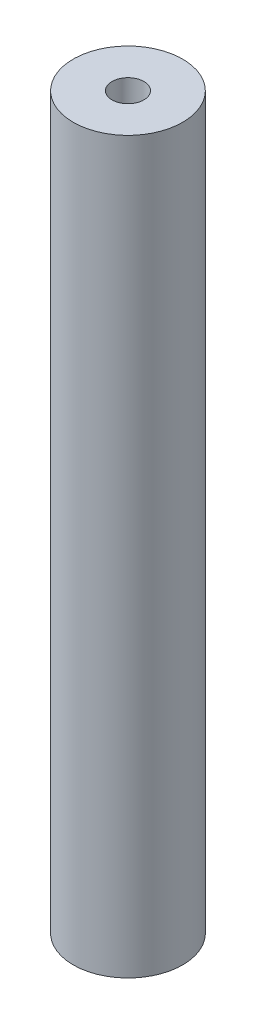
ISO-10303-21;
HEADER;
FILE_DESCRIPTION(('STEP AP214'),'2;1');
FILE_NAME('part.step','',(''),(''),'','','');
FILE_SCHEMA(('AUTOMOTIVE_DESIGN { 1 0 10303 214 1 1 1 1 }'));
ENDSEC;
DATA;
#1=APPLICATION_CONTEXT('core data for automotive mechanical design processes');
#2=APPLICATION_PROTOCOL_DEFINITION('international standard','automotive_design',2000,#1);
#3=PRODUCT_CONTEXT('',#1,'mechanical');
#4=PRODUCT('Part','Part','',(#3));
#5=PRODUCT_RELATED_PRODUCT_CATEGORY('part','',(#4));
#6=PRODUCT_DEFINITION_FORMATION('','',#4);
#7=PRODUCT_DEFINITION_CONTEXT('part definition',#1,'design');
#8=PRODUCT_DEFINITION('design','',#6,#7);
#9=PRODUCT_DEFINITION_SHAPE('','',#8);
#10=(LENGTH_UNIT() NAMED_UNIT(*) SI_UNIT(.MILLI.,.METRE.));
#11=(NAMED_UNIT(*) PLANE_ANGLE_UNIT() SI_UNIT($,.RADIAN.));
#12=(NAMED_UNIT(*) SI_UNIT($,.STERADIAN.) SOLID_ANGLE_UNIT());
#13=UNCERTAINTY_MEASURE_WITH_UNIT(LENGTH_MEASURE(1.E-05),#10,'distance_accuracy_value','');
#14=(GEOMETRIC_REPRESENTATION_CONTEXT(3) GLOBAL_UNCERTAINTY_ASSIGNED_CONTEXT((#13)) GLOBAL_UNIT_ASSIGNED_CONTEXT((#10,
#11,#12)) REPRESENTATION_CONTEXT('',''));
#15=CARTESIAN_POINT('',(0.,0.,0.));
#16=DIRECTION('',(0.,0.,1.));
#17=DIRECTION('',(1.,0.,0.));
#18=AXIS2_PLACEMENT_3D('',#15,#16,#17);
#19=CARTESIAN_POINT('',(0.,40.,0.));
#20=DIRECTION('',(0.,-1.,0.));
#21=DIRECTION('',(0.,0.,-1.));
#22=AXIS2_PLACEMENT_3D('',#19,#20,#21);
#23=CYLINDRICAL_SURFACE('',#22,3.);
#24=CARTESIAN_POINT('',(0.,40.,0.));
#25=DIRECTION('',(0.,1.,0.));
#26=DIRECTION('',(0.,0.,1.));
#27=AXIS2_PLACEMENT_3D('',#24,#25,#26);
#28=CIRCLE('',#27,3.);
#29=CARTESIAN_POINT('',(0.,40.,3.));
#30=VERTEX_POINT('',#29);
#31=EDGE_CURVE('E10',#30,#30,#28,.T.);
#32=ORIENTED_EDGE('',*,*,#31,.F.);
#33=EDGE_LOOP('',(#32));
#34=FACE_BOUND('',#33,.T.);
#35=CARTESIAN_POINT('',(0.,0.,0.));
#36=DIRECTION('',(0.,1.,0.));
#37=DIRECTION('',(0.,0.,1.));
#38=AXIS2_PLACEMENT_3D('',#35,#36,#37);
#39=CIRCLE('',#38,3.);
#40=CARTESIAN_POINT('',(0.,0.,3.));
#41=VERTEX_POINT('',#40);
#42=EDGE_CURVE('E34',#41,#41,#39,.T.);
#43=ORIENTED_EDGE('',*,*,#42,.T.);
#44=EDGE_LOOP('',(#43));
#45=FACE_BOUND('',#44,.T.);
#46=ADVANCED_FACE('F31',(#34,#45),#23,.T.);
#47=CARTESIAN_POINT('',(0.,40.,0.));
#48=DIRECTION('',(0.,1.,0.));
#49=DIRECTION('',(0.,0.,1.));
#50=AXIS2_PLACEMENT_3D('',#47,#48,#49);
#51=PLANE('',#50);
#52=CARTESIAN_POINT('',(0.,40.,0.));
#53=DIRECTION('',(0.,1.,0.));
#54=DIRECTION('',(0.,0.,1.));
#55=AXIS2_PLACEMENT_3D('',#52,#53,#54);
#56=CIRCLE('',#55,0.875);
#57=CARTESIAN_POINT('',(0.,40.,0.875));
#58=VERTEX_POINT('',#57);
#59=EDGE_CURVE('E43',#58,#58,#56,.T.);
#60=ORIENTED_EDGE('',*,*,#59,.F.);
#61=EDGE_LOOP('',(#60));
#62=FACE_BOUND('',#61,.T.);
#63=ORIENTED_EDGE('',*,*,#31,.T.);
#64=EDGE_LOOP('',(#63));
#65=FACE_BOUND('',#64,.T.);
#66=ADVANCED_FACE('F58',(#62,#65),#51,.T.);
#67=CARTESIAN_POINT('',(0.,0.,0.));
#68=DIRECTION('',(0.,1.,0.));
#69=DIRECTION('',(0.,0.,1.));
#70=AXIS2_PLACEMENT_3D('',#67,#68,#69);
#71=PLANE('',#70);
#72=CARTESIAN_POINT('',(0.,0.,0.));
#73=DIRECTION('',(0.,1.,0.));
#74=DIRECTION('',(0.,0.,1.));
#75=AXIS2_PLACEMENT_3D('',#72,#73,#74);
#76=CIRCLE('',#75,0.875);
#77=CARTESIAN_POINT('',(0.,0.,0.875));
#78=VERTEX_POINT('',#77);
#79=EDGE_CURVE('E41',#78,#78,#76,.T.);
#80=ORIENTED_EDGE('',*,*,#79,.T.);
#81=EDGE_LOOP('',(#80));
#82=FACE_BOUND('',#81,.T.);
#83=ORIENTED_EDGE('',*,*,#42,.F.);
#84=EDGE_LOOP('',(#83));
#85=FACE_BOUND('',#84,.T.);
#86=ADVANCED_FACE('F49',(#82,#85),#71,.F.);
#87=CARTESIAN_POINT('',(0.,0.,0.));
#88=DIRECTION('',(0.,1.,0.));
#89=DIRECTION('',(0.,0.,1.));
#90=AXIS2_PLACEMENT_3D('',#87,#88,#89);
#91=CYLINDRICAL_SURFACE('',#90,0.875);
#92=ORIENTED_EDGE('',*,*,#79,.F.);
#93=EDGE_LOOP('',(#92));
#94=FACE_BOUND('',#93,.T.);
#95=ORIENTED_EDGE('',*,*,#59,.T.);
#96=EDGE_LOOP('',(#95));
#97=FACE_BOUND('',#96,.T.);
#98=ADVANCED_FACE('F52',(#94,#97),#91,.F.);
#99=CLOSED_SHELL('',(#46,#66,#86,#98));
#100=MANIFOLD_SOLID_BREP('B2',#99);
#101=ADVANCED_BREP_SHAPE_REPRESENTATION('',(#18,#100),#14);
#102=SHAPE_DEFINITION_REPRESENTATION(#9,#101);
ENDSEC;
END-ISO-10303-21;
